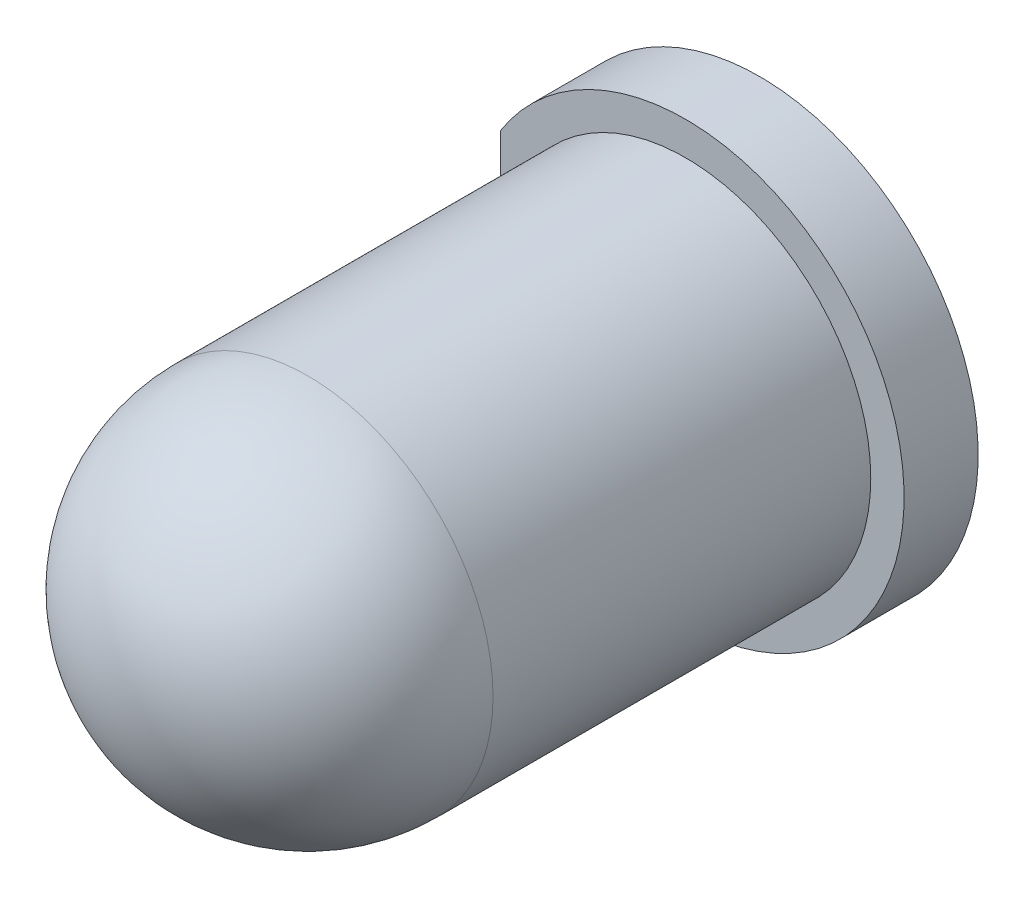
ISO-10303-21;
HEADER;
FILE_DESCRIPTION(('STEP AP214'),'2;1');
FILE_NAME('part.step','',(''),(''),'','','');
FILE_SCHEMA(('AUTOMOTIVE_DESIGN { 1 0 10303 214 1 1 1 1 }'));
ENDSEC;
DATA;
#1=APPLICATION_CONTEXT('core data for automotive mechanical design processes');
#2=APPLICATION_PROTOCOL_DEFINITION('international standard','automotive_design',2000,#1);
#3=PRODUCT_CONTEXT('',#1,'mechanical');
#4=PRODUCT('Part','Part','',(#3));
#5=PRODUCT_RELATED_PRODUCT_CATEGORY('part','',(#4));
#6=PRODUCT_DEFINITION_FORMATION('','',#4);
#7=PRODUCT_DEFINITION_CONTEXT('part definition',#1,'design');
#8=PRODUCT_DEFINITION('design','',#6,#7);
#9=PRODUCT_DEFINITION_SHAPE('','',#8);
#10=(LENGTH_UNIT() NAMED_UNIT(*) SI_UNIT(.MILLI.,.METRE.));
#11=(NAMED_UNIT(*) PLANE_ANGLE_UNIT() SI_UNIT($,.RADIAN.));
#12=(NAMED_UNIT(*) SI_UNIT($,.STERADIAN.) SOLID_ANGLE_UNIT());
#13=UNCERTAINTY_MEASURE_WITH_UNIT(LENGTH_MEASURE(1.E-05),#10,'distance_accuracy_value','');
#14=(GEOMETRIC_REPRESENTATION_CONTEXT(3) GLOBAL_UNCERTAINTY_ASSIGNED_CONTEXT((#13)) GLOBAL_UNIT_ASSIGNED_CONTEXT((#10,
#11,#12)) REPRESENTATION_CONTEXT('',''));
#15=CARTESIAN_POINT('',(0.,0.,0.));
#16=DIRECTION('',(0.,0.,1.));
#17=DIRECTION('',(1.,0.,0.));
#18=AXIS2_PLACEMENT_3D('',#15,#16,#17);
#19=CARTESIAN_POINT('',(-0.545688576345,-11.18353362302,51.32575127283));
#20=DIRECTION('',(-1.,0.,0.));
#21=DIRECTION('',(0.,0.,1.));
#22=AXIS2_PLACEMENT_3D('',#19,#20,#21);
#23=PLANE('',#22);
#24=DIRECTION('',(0.,0.,1.));
#25=VECTOR('',#24,1.);
#26=CARTESIAN_POINT('',(-0.545688576345,-11.18353362302,51.62575127283));
#27=LINE('',#26,#25);
#28=CARTESIAN_POINT('',(-0.545688576345,-11.1835336230217,51.32575127283));
#29=VERTEX_POINT('',#28);
#30=CARTESIAN_POINT('',(-0.545688576345,-11.1835336230217,51.92575127283));
#31=VERTEX_POINT('',#30);
#32=EDGE_CURVE('E46',#29,#31,#27,.T.);
#33=ORIENTED_EDGE('',*,*,#32,.T.);
#34=DIRECTION('',(0.,1.,0.));
#35=VECTOR('',#34,1.);
#36=CARTESIAN_POINT('',(-0.545688576345,-11.18353362302,51.92575127283));
#37=LINE('',#36,#35);
#38=CARTESIAN_POINT('',(-0.545688576345,-9.30427845141883,51.92575127283));
#39=VERTEX_POINT('',#38);
#40=EDGE_CURVE('E21',#31,#39,#37,.T.);
#41=ORIENTED_EDGE('',*,*,#40,.T.);
#42=DIRECTION('',(0.,0.,-1.));
#43=VECTOR('',#42,1.);
#44=CARTESIAN_POINT('',(-0.545688576345,-9.304278451421,51.62575127283));
#45=LINE('',#44,#43);
#46=CARTESIAN_POINT('',(-0.545688576345,-9.30427845141883,51.32575127283));
#47=VERTEX_POINT('',#46);
#48=EDGE_CURVE('E36',#39,#47,#45,.T.);
#49=ORIENTED_EDGE('',*,*,#48,.T.);
#50=DIRECTION('',(0.,-1.,0.));
#51=VECTOR('',#50,1.);
#52=CARTESIAN_POINT('',(-0.545688576345,-10.2439060372215,51.32575127283));
#53=LINE('',#52,#51);
#54=EDGE_CURVE('E47',#47,#29,#53,.T.);
#55=ORIENTED_EDGE('',*,*,#54,.T.);
#56=EDGE_LOOP('',(#33,#41,#49,#55));
#57=FACE_BOUND('',#56,.T.);
#58=ADVANCED_FACE('F17',(#57),#23,.T.);
#59=CARTESIAN_POINT('',(-0.545688576345,-12.04930603722,51.32575127283));
#60=DIRECTION('',(0.,0.,1.));
#61=DIRECTION('',(1.,0.,0.));
#62=AXIS2_PLACEMENT_3D('',#59,#60,#61);
#63=PLANE('',#62);
#64=CARTESIAN_POINT('',(0.954311423653245,-10.24390603722,51.32575127283));
#65=DIRECTION('',(0.,0.,1.));
#66=DIRECTION('',(1.,0.,0.));
#67=AXIS2_PLACEMENT_3D('',#64,#65,#66);
#68=CIRCLE('',#67,1.76999999999925);
#69=EDGE_CURVE('E53',#29,#47,#68,.T.);
#70=ORIENTED_EDGE('',*,*,#69,.F.);
#71=ORIENTED_EDGE('',*,*,#54,.F.);
#72=EDGE_LOOP('',(#70,#71));
#73=FACE_BOUND('',#72,.T.);
#74=ADVANCED_FACE('F63',(#73),#63,.F.);
#75=CARTESIAN_POINT('',(0.954311423653245,-10.24390603722,51.32575127283));
#76=DIRECTION('',(0.,0.,1.));
#77=DIRECTION('',(1.,0.,0.));
#78=AXIS2_PLACEMENT_3D('',#75,#76,#77);
#79=CYLINDRICAL_SURFACE('',#78,1.76999999999925);
#80=ORIENTED_EDGE('',*,*,#48,.F.);
#81=CARTESIAN_POINT('',(0.954311423653245,-10.24390603722,51.92575127283));
#82=DIRECTION('',(0.,0.,1.));
#83=DIRECTION('',(1.,0.,0.));
#84=AXIS2_PLACEMENT_3D('',#81,#82,#83);
#85=CIRCLE('',#84,1.76999999999925);
#86=EDGE_CURVE('E51',#39,#31,#85,.F.);
#87=ORIENTED_EDGE('',*,*,#86,.T.);
#88=ORIENTED_EDGE('',*,*,#32,.F.);
#89=ORIENTED_EDGE('',*,*,#69,.T.);
#90=EDGE_LOOP('',(#80,#87,#88,#89));
#91=FACE_BOUND('',#90,.T.);
#92=ADVANCED_FACE('F50',(#91),#79,.T.);
#93=CARTESIAN_POINT('',(0.954311423655007,-10.24390603722,54.98575127283));
#94=DIRECTION('',(0.,0.,1.));
#95=DIRECTION('',(-1.,0.,0.));
#96=AXIS2_PLACEMENT_3D('',#93,#94,#95);
#97=SPHERICAL_SURFACE('',#96,1.50000000000002);
#98=CARTESIAN_POINT('',(0.95431142365749,-10.24390603722,54.98575127283));
#99=DIRECTION('',(0.,0.,-1.));
#100=DIRECTION('',(1.,0.,0.));
#101=AXIS2_PLACEMENT_3D('',#98,#99,#100);
#102=CIRCLE('',#101,1.49999999999655);
#103=CARTESIAN_POINT('',(2.45431142365404,-10.24390603722,54.98575127283));
#104=VERTEX_POINT('',#103);
#105=EDGE_CURVE('E27',#104,#104,#102,.T.);
#106=ORIENTED_EDGE('',*,*,#105,.F.);
#107=EDGE_LOOP('',(#106));
#108=FACE_BOUND('',#107,.T.);
#109=ADVANCED_FACE('F71',(#108),#97,.T.);
#110=CARTESIAN_POINT('',(2.724311423655,-12.04930603722,51.92575127283));
#111=DIRECTION('',(0.,0.,-1.));
#112=DIRECTION('',(-1.,0.,0.));
#113=AXIS2_PLACEMENT_3D('',#110,#111,#112);
#114=PLANE('',#113);
#115=ORIENTED_EDGE('',*,*,#86,.F.);
#116=ORIENTED_EDGE('',*,*,#40,.F.);
#117=EDGE_LOOP('',(#115,#116));
#118=FACE_BOUND('',#117,.T.);
#119=CARTESIAN_POINT('',(0.95431142365749,-10.24390603722,51.92575127283));
#120=DIRECTION('',(0.,0.,1.));
#121=DIRECTION('',(1.,0.,0.));
#122=AXIS2_PLACEMENT_3D('',#119,#120,#121);
#123=CIRCLE('',#122,1.49999999999655);
#124=CARTESIAN_POINT('',(2.45431142365404,-10.24390603722,51.92575127283));
#125=VERTEX_POINT('',#124);
#126=EDGE_CURVE('E11',#125,#125,#123,.T.);
#127=ORIENTED_EDGE('',*,*,#126,.F.);
#128=EDGE_LOOP('',(#127));
#129=FACE_BOUND('',#128,.T.);
#130=ADVANCED_FACE('F55',(#118,#129),#114,.F.);
#131=CARTESIAN_POINT('',(0.95431142365749,-10.24390603722,51.92575127283));
#132=DIRECTION('',(0.,0.,1.));
#133=DIRECTION('',(1.,0.,0.));
#134=AXIS2_PLACEMENT_3D('',#131,#132,#133);
#135=CYLINDRICAL_SURFACE('',#134,1.49999999999655);
#136=ORIENTED_EDGE('',*,*,#126,.T.);
#137=EDGE_LOOP('',(#136));
#138=FACE_BOUND('',#137,.T.);
#139=ORIENTED_EDGE('',*,*,#105,.T.);
#140=EDGE_LOOP('',(#139));
#141=FACE_BOUND('',#140,.T.);
#142=ADVANCED_FACE('F19',(#138,#141),#135,.T.);
#143=CLOSED_SHELL('',(#58,#74,#92,#109,#130,#142));
#144=MANIFOLD_SOLID_BREP('B1',#143);
#145=ADVANCED_BREP_SHAPE_REPRESENTATION('',(#18,#144),#14);
#146=SHAPE_DEFINITION_REPRESENTATION(#9,#145);
ENDSEC;
END-ISO-10303-21;
